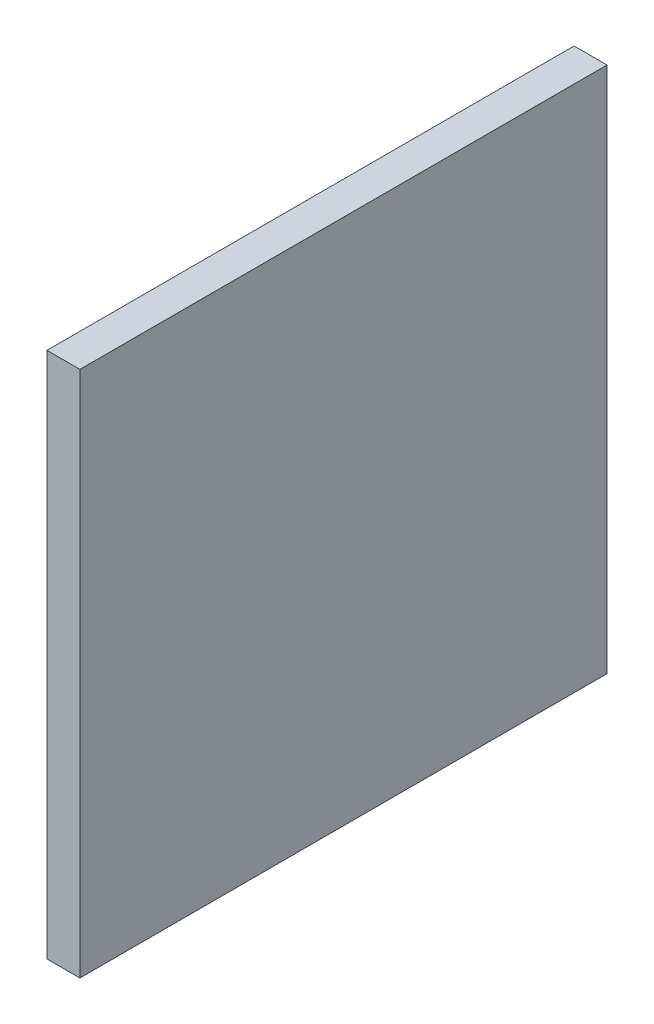
ISO-10303-21;
HEADER;
FILE_DESCRIPTION(('STEP AP214'),'2;1');
FILE_NAME('part.step','',(''),(''),'','','');
FILE_SCHEMA(('AUTOMOTIVE_DESIGN { 1 0 10303 214 1 1 1 1 }'));
ENDSEC;
DATA;
#1=APPLICATION_CONTEXT('core data for automotive mechanical design processes');
#2=APPLICATION_PROTOCOL_DEFINITION('international standard','automotive_design',2000,#1);
#3=PRODUCT_CONTEXT('',#1,'mechanical');
#4=PRODUCT('Part','Part','',(#3));
#5=PRODUCT_RELATED_PRODUCT_CATEGORY('part','',(#4));
#6=PRODUCT_DEFINITION_FORMATION('','',#4);
#7=PRODUCT_DEFINITION_CONTEXT('part definition',#1,'design');
#8=PRODUCT_DEFINITION('design','',#6,#7);
#9=PRODUCT_DEFINITION_SHAPE('','',#8);
#10=(LENGTH_UNIT() NAMED_UNIT(*) SI_UNIT(.MILLI.,.METRE.));
#11=(NAMED_UNIT(*) PLANE_ANGLE_UNIT() SI_UNIT($,.RADIAN.));
#12=(NAMED_UNIT(*) SI_UNIT($,.STERADIAN.) SOLID_ANGLE_UNIT());
#13=UNCERTAINTY_MEASURE_WITH_UNIT(LENGTH_MEASURE(1.E-05),#10,'distance_accuracy_value','');
#14=(GEOMETRIC_REPRESENTATION_CONTEXT(3) GLOBAL_UNCERTAINTY_ASSIGNED_CONTEXT((#13)) GLOBAL_UNIT_ASSIGNED_CONTEXT((#10,
#11,#12)) REPRESENTATION_CONTEXT('',''));
#15=CARTESIAN_POINT('',(0.,0.,0.));
#16=DIRECTION('',(0.,0.,1.));
#17=DIRECTION('',(1.,0.,0.));
#18=AXIS2_PLACEMENT_3D('',#15,#16,#17);
#19=CARTESIAN_POINT('',(5.,0.,0.));
#20=DIRECTION('',(0.,0.,1.));
#21=DIRECTION('',(1.,0.,0.));
#22=AXIS2_PLACEMENT_3D('',#19,#20,#21);
#23=PLANE('',#22);
#24=DIRECTION('',(0.,1.,0.));
#25=VECTOR('',#24,1.);
#26=CARTESIAN_POINT('',(0.,0.,0.));
#27=LINE('',#26,#25);
#28=CARTESIAN_POINT('',(0.,0.,0.));
#29=VERTEX_POINT('',#28);
#30=CARTESIAN_POINT('',(0.,80.,0.));
#31=VERTEX_POINT('',#30);
#32=EDGE_CURVE('E107',#29,#31,#27,.T.);
#33=ORIENTED_EDGE('',*,*,#32,.T.);
#34=DIRECTION('',(-1.,0.,0.));
#35=VECTOR('',#34,1.);
#36=CARTESIAN_POINT('',(5.,80.,0.));
#37=LINE('',#36,#35);
#38=CARTESIAN_POINT('',(5.,80.,0.));
#39=VERTEX_POINT('',#38);
#40=EDGE_CURVE('E11',#39,#31,#37,.T.);
#41=ORIENTED_EDGE('',*,*,#40,.F.);
#42=DIRECTION('',(0.,1.,0.));
#43=VECTOR('',#42,1.);
#44=CARTESIAN_POINT('',(5.,0.,0.));
#45=LINE('',#44,#43);
#46=CARTESIAN_POINT('',(5.,0.,0.));
#47=VERTEX_POINT('',#46);
#48=EDGE_CURVE('E91',#47,#39,#45,.T.);
#49=ORIENTED_EDGE('',*,*,#48,.F.);
#50=DIRECTION('',(-1.,0.,0.));
#51=VECTOR('',#50,1.);
#52=CARTESIAN_POINT('',(5.,0.,0.));
#53=LINE('',#52,#51);
#54=EDGE_CURVE('E103',#47,#29,#53,.T.);
#55=ORIENTED_EDGE('',*,*,#54,.T.);
#56=EDGE_LOOP('',(#33,#41,#49,#55));
#57=FACE_BOUND('',#56,.T.);
#58=ADVANCED_FACE('F39',(#57),#23,.F.);
#59=CARTESIAN_POINT('',(5.,80.,0.));
#60=DIRECTION('',(0.,-1.,0.));
#61=DIRECTION('',(0.,0.,-1.));
#62=AXIS2_PLACEMENT_3D('',#59,#60,#61);
#63=PLANE('',#62);
#64=DIRECTION('',(0.,0.,1.));
#65=VECTOR('',#64,1.);
#66=CARTESIAN_POINT('',(0.,80.,0.));
#67=LINE('',#66,#65);
#68=CARTESIAN_POINT('',(0.,80.,80.));
#69=VERTEX_POINT('',#68);
#70=EDGE_CURVE('E96',#31,#69,#67,.T.);
#71=ORIENTED_EDGE('',*,*,#70,.T.);
#72=DIRECTION('',(-1.,0.,0.));
#73=VECTOR('',#72,1.);
#74=CARTESIAN_POINT('',(5.,80.,80.));
#75=LINE('',#74,#73);
#76=CARTESIAN_POINT('',(5.,80.,80.));
#77=VERTEX_POINT('',#76);
#78=EDGE_CURVE('E48',#77,#69,#75,.T.);
#79=ORIENTED_EDGE('',*,*,#78,.F.);
#80=DIRECTION('',(0.,0.,1.));
#81=VECTOR('',#80,1.);
#82=CARTESIAN_POINT('',(5.,80.,0.));
#83=LINE('',#82,#81);
#84=EDGE_CURVE('E86',#39,#77,#83,.T.);
#85=ORIENTED_EDGE('',*,*,#84,.F.);
#86=ORIENTED_EDGE('',*,*,#40,.T.);
#87=EDGE_LOOP('',(#71,#79,#85,#86));
#88=FACE_BOUND('',#87,.T.);
#89=ADVANCED_FACE('F95',(#88),#63,.F.);
#90=CARTESIAN_POINT('',(5.,0.,80.));
#91=DIRECTION('',(0.,0.,-1.));
#92=DIRECTION('',(-1.,0.,0.));
#93=AXIS2_PLACEMENT_3D('',#90,#91,#92);
#94=PLANE('',#93);
#95=DIRECTION('',(0.,-1.,0.));
#96=VECTOR('',#95,1.);
#97=CARTESIAN_POINT('',(0.,0.,80.));
#98=LINE('',#97,#96);
#99=CARTESIAN_POINT('',(0.,0.,80.));
#100=VERTEX_POINT('',#99);
#101=EDGE_CURVE('E73',#69,#100,#98,.T.);
#102=ORIENTED_EDGE('',*,*,#101,.T.);
#103=DIRECTION('',(-1.,0.,0.));
#104=VECTOR('',#103,1.);
#105=CARTESIAN_POINT('',(5.,0.,80.));
#106=LINE('',#105,#104);
#107=CARTESIAN_POINT('',(5.,0.,80.));
#108=VERTEX_POINT('',#107);
#109=EDGE_CURVE('E98',#108,#100,#106,.T.);
#110=ORIENTED_EDGE('',*,*,#109,.F.);
#111=DIRECTION('',(0.,-1.,0.));
#112=VECTOR('',#111,1.);
#113=CARTESIAN_POINT('',(5.,0.,80.));
#114=LINE('',#113,#112);
#115=EDGE_CURVE('E89',#77,#108,#114,.T.);
#116=ORIENTED_EDGE('',*,*,#115,.F.);
#117=ORIENTED_EDGE('',*,*,#78,.T.);
#118=EDGE_LOOP('',(#102,#110,#116,#117));
#119=FACE_BOUND('',#118,.T.);
#120=ADVANCED_FACE('F99',(#119),#94,.F.);
#121=CARTESIAN_POINT('',(5.,0.,0.));
#122=DIRECTION('',(0.,1.,0.));
#123=DIRECTION('',(0.,0.,1.));
#124=AXIS2_PLACEMENT_3D('',#121,#122,#123);
#125=PLANE('',#124);
#126=DIRECTION('',(0.,0.,-1.));
#127=VECTOR('',#126,1.);
#128=CARTESIAN_POINT('',(0.,0.,0.));
#129=LINE('',#128,#127);
#130=EDGE_CURVE('E79',#100,#29,#129,.T.);
#131=ORIENTED_EDGE('',*,*,#130,.T.);
#132=ORIENTED_EDGE('',*,*,#54,.F.);
#133=DIRECTION('',(0.,0.,-1.));
#134=VECTOR('',#133,1.);
#135=CARTESIAN_POINT('',(5.,0.,0.));
#136=LINE('',#135,#134);
#137=EDGE_CURVE('E56',#108,#47,#136,.T.);
#138=ORIENTED_EDGE('',*,*,#137,.F.);
#139=ORIENTED_EDGE('',*,*,#109,.T.);
#140=EDGE_LOOP('',(#131,#132,#138,#139));
#141=FACE_BOUND('',#140,.T.);
#142=ADVANCED_FACE('F120',(#141),#125,.F.);
#143=CARTESIAN_POINT('',(5.,0.,0.));
#144=DIRECTION('',(1.,0.,0.));
#145=DIRECTION('',(0.,0.,-1.));
#146=AXIS2_PLACEMENT_3D('',#143,#144,#145);
#147=PLANE('',#146);
#148=ORIENTED_EDGE('',*,*,#48,.T.);
#149=ORIENTED_EDGE('',*,*,#84,.T.);
#150=ORIENTED_EDGE('',*,*,#115,.T.);
#151=ORIENTED_EDGE('',*,*,#137,.T.);
#152=EDGE_LOOP('',(#148,#149,#150,#151));
#153=FACE_BOUND('',#152,.T.);
#154=ADVANCED_FACE('F87',(#153),#147,.T.);
#155=CARTESIAN_POINT('',(0.,0.,0.));
#156=DIRECTION('',(1.,0.,0.));
#157=DIRECTION('',(0.,0.,-1.));
#158=AXIS2_PLACEMENT_3D('',#155,#156,#157);
#159=PLANE('',#158);
#160=ORIENTED_EDGE('',*,*,#32,.F.);
#161=ORIENTED_EDGE('',*,*,#130,.F.);
#162=ORIENTED_EDGE('',*,*,#101,.F.);
#163=ORIENTED_EDGE('',*,*,#70,.F.);
#164=EDGE_LOOP('',(#160,#161,#162,#163));
#165=FACE_BOUND('',#164,.T.);
#166=ADVANCED_FACE('F123',(#165),#159,.F.);
#167=CLOSED_SHELL('',(#58,#89,#120,#142,#154,#166));
#168=MANIFOLD_SOLID_BREP('B2',#167);
#169=ADVANCED_BREP_SHAPE_REPRESENTATION('',(#18,#168),#14);
#170=SHAPE_DEFINITION_REPRESENTATION(#9,#169);
ENDSEC;
END-ISO-10303-21;
